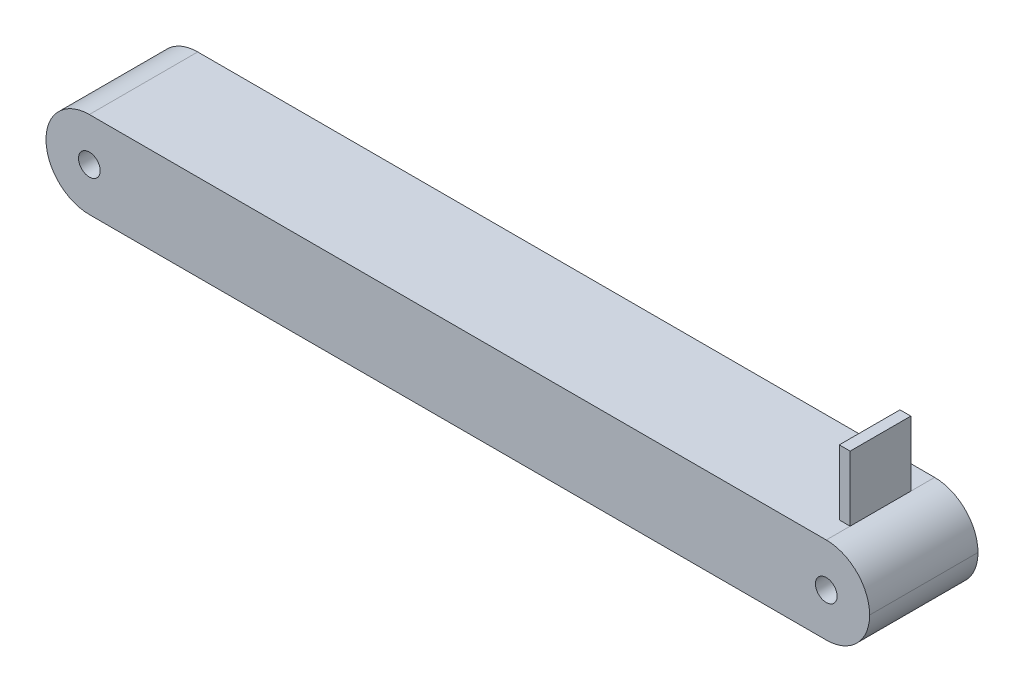
ISO-10303-21;
HEADER;
FILE_DESCRIPTION(('STEP AP214'),'2;1');
FILE_NAME('part.step','',(''),(''),'','','');
FILE_SCHEMA(('AUTOMOTIVE_DESIGN { 1 0 10303 214 1 1 1 1 }'));
ENDSEC;
DATA;
#1=APPLICATION_CONTEXT('core data for automotive mechanical design processes');
#2=APPLICATION_PROTOCOL_DEFINITION('international standard','automotive_design',2000,#1);
#3=PRODUCT_CONTEXT('',#1,'mechanical');
#4=PRODUCT('Part','Part','',(#3));
#5=PRODUCT_RELATED_PRODUCT_CATEGORY('part','',(#4));
#6=PRODUCT_DEFINITION_FORMATION('','',#4);
#7=PRODUCT_DEFINITION_CONTEXT('part definition',#1,'design');
#8=PRODUCT_DEFINITION('design','',#6,#7);
#9=PRODUCT_DEFINITION_SHAPE('','',#8);
#10=(LENGTH_UNIT() NAMED_UNIT(*) SI_UNIT(.MILLI.,.METRE.));
#11=(NAMED_UNIT(*) PLANE_ANGLE_UNIT() SI_UNIT($,.RADIAN.));
#12=(NAMED_UNIT(*) SI_UNIT($,.STERADIAN.) SOLID_ANGLE_UNIT());
#13=UNCERTAINTY_MEASURE_WITH_UNIT(LENGTH_MEASURE(1.E-05),#10,'distance_accuracy_value','');
#14=(GEOMETRIC_REPRESENTATION_CONTEXT(3) GLOBAL_UNCERTAINTY_ASSIGNED_CONTEXT((#13)) GLOBAL_UNIT_ASSIGNED_CONTEXT((#10,
#11,#12)) REPRESENTATION_CONTEXT('',''));
#15=CARTESIAN_POINT('',(0.,0.,0.));
#16=DIRECTION('',(0.,0.,1.));
#17=DIRECTION('',(1.,0.,0.));
#18=AXIS2_PLACEMENT_3D('',#15,#16,#17);
#19=CARTESIAN_POINT('',(0.,40.,0.));
#20=DIRECTION('',(0.,1.,0.));
#21=DIRECTION('',(0.,0.,1.));
#22=AXIS2_PLACEMENT_3D('',#19,#20,#21);
#23=PLANE('',#22);
#24=DIRECTION('',(0.,0.,1.));
#25=VECTOR('',#24,1.);
#26=CARTESIAN_POINT('',(198.626062322946,40.,19.5949008498583));
#27=LINE('',#26,#25);
#28=CARTESIAN_POINT('',(198.626062322946,40.,-8.40509915014166));
#29=VERTEX_POINT('',#28);
#30=CARTESIAN_POINT('',(198.626062322946,40.,19.5949008498583));
#31=VERTEX_POINT('',#30);
#32=EDGE_CURVE('E56',#29,#31,#27,.T.);
#33=ORIENTED_EDGE('',*,*,#32,.F.);
#34=DIRECTION('',(-1.,0.,0.));
#35=VECTOR('',#34,1.);
#36=CARTESIAN_POINT('',(203.626062322946,40.,-8.40509915014166));
#37=LINE('',#36,#35);
#38=CARTESIAN_POINT('',(203.626062322946,40.,-8.40509915014166));
#39=VERTEX_POINT('',#38);
#40=EDGE_CURVE('E352',#39,#29,#37,.T.);
#41=ORIENTED_EDGE('',*,*,#40,.F.);
#42=DIRECTION('',(0.,0.,-1.));
#43=VECTOR('',#42,1.);
#44=CARTESIAN_POINT('',(203.626062322946,40.,-19.4050991501417));
#45=LINE('',#44,#43);
#46=CARTESIAN_POINT('',(203.626062322946,40.,-19.4050991501417));
#47=VERTEX_POINT('',#46);
#48=EDGE_CURVE('E48',#39,#47,#45,.T.);
#49=ORIENTED_EDGE('',*,*,#48,.T.);
#50=DIRECTION('',(-1.,0.,0.));
#51=VECTOR('',#50,1.);
#52=CARTESIAN_POINT('',(-156.373937677054,40.,-19.4050991501417));
#53=LINE('',#52,#51);
#54=CARTESIAN_POINT('',(-136.373937677054,40.,-19.4050991501417));
#55=VERTEX_POINT('',#54);
#56=EDGE_CURVE('E241',#47,#55,#53,.T.);
#57=ORIENTED_EDGE('',*,*,#56,.T.);
#58=DIRECTION('',(0.,0.,1.));
#59=VECTOR('',#58,1.);
#60=CARTESIAN_POINT('',(-136.373937677054,40.,30.5949008498583));
#61=LINE('',#60,#59);
#62=CARTESIAN_POINT('',(-136.373937677054,40.,30.5949008498583));
#63=VERTEX_POINT('',#62);
#64=EDGE_CURVE('E271',#55,#63,#61,.T.);
#65=ORIENTED_EDGE('',*,*,#64,.T.);
#66=DIRECTION('',(1.,0.,0.));
#67=VECTOR('',#66,1.);
#68=CARTESIAN_POINT('',(-156.373937677054,40.,30.5949008498583));
#69=LINE('',#68,#67);
#70=CARTESIAN_POINT('',(203.626062322946,40.,30.5949008498583));
#71=VERTEX_POINT('',#70);
#72=EDGE_CURVE('E238',#63,#71,#69,.T.);
#73=ORIENTED_EDGE('',*,*,#72,.T.);
#74=CARTESIAN_POINT('',(203.626062322946,40.,19.5949008498583));
#75=VERTEX_POINT('',#74);
#76=EDGE_CURVE('E11',#71,#75,#45,.T.);
#77=ORIENTED_EDGE('',*,*,#76,.T.);
#78=DIRECTION('',(1.,0.,0.));
#79=VECTOR('',#78,1.);
#80=CARTESIAN_POINT('',(203.626062322946,40.,19.5949008498583));
#81=LINE('',#80,#79);
#82=EDGE_CURVE('E60',#31,#75,#81,.T.);
#83=ORIENTED_EDGE('',*,*,#82,.F.);
#84=EDGE_LOOP('',(#33,#41,#49,#57,#65,#73,#77,#83));
#85=FACE_BOUND('',#84,.T.);
#86=ADVANCED_FACE('F39',(#85),#23,.T.);
#87=CARTESIAN_POINT('',(-141.373937677054,35.,-19.4050991501417));
#88=DIRECTION('',(1.,0.,0.));
#89=DIRECTION('',(0.,0.,-1.));
#90=AXIS2_PLACEMENT_3D('',#87,#88,#89);
#91=PLANE('',#90);
#92=DIRECTION('',(0.,-1.,0.));
#93=VECTOR('',#92,1.);
#94=CARTESIAN_POINT('',(-141.373937677054,35.,15.5949008498583));
#95=LINE('',#94,#93);
#96=CARTESIAN_POINT('',(-141.373937677054,35.,15.5949008498583));
#97=VERTEX_POINT('',#96);
#98=CARTESIAN_POINT('',(-141.373937677054,20.,15.5949008498583));
#99=VERTEX_POINT('',#98);
#100=EDGE_CURVE('E234',#97,#99,#95,.T.);
#101=ORIENTED_EDGE('',*,*,#100,.T.);
#102=CARTESIAN_POINT('',(-141.373937677054,5.,15.5949008498583));
#103=VERTEX_POINT('',#102);
#104=EDGE_CURVE('E233',#99,#103,#95,.T.);
#105=ORIENTED_EDGE('',*,*,#104,.T.);
#106=DIRECTION('',(0.,0.,1.));
#107=VECTOR('',#106,1.);
#108=CARTESIAN_POINT('',(-141.373937677054,5.,-19.4050991501417));
#109=LINE('',#108,#107);
#110=CARTESIAN_POINT('',(-141.373937677054,5.,-4.40509915014166));
#111=VERTEX_POINT('',#110);
#112=EDGE_CURVE('E210',#111,#103,#109,.T.);
#113=ORIENTED_EDGE('',*,*,#112,.F.);
#114=DIRECTION('',(0.,-1.,0.));
#115=VECTOR('',#114,1.);
#116=CARTESIAN_POINT('',(-141.373937677054,35.,-4.40509915014166));
#117=LINE('',#116,#115);
#118=CARTESIAN_POINT('',(-141.373937677054,20.,-4.40509915014166));
#119=VERTEX_POINT('',#118);
#120=EDGE_CURVE('E209',#119,#111,#117,.T.);
#121=ORIENTED_EDGE('',*,*,#120,.F.);
#122=CARTESIAN_POINT('',(-141.373937677054,35.,-4.40509915014166));
#123=VERTEX_POINT('',#122);
#124=EDGE_CURVE('E222',#123,#119,#117,.T.);
#125=ORIENTED_EDGE('',*,*,#124,.F.);
#126=DIRECTION('',(0.,0.,1.));
#127=VECTOR('',#126,1.);
#128=CARTESIAN_POINT('',(-141.373937677054,35.,-19.4050991501417));
#129=LINE('',#128,#127);
#130=EDGE_CURVE('E199',#123,#97,#129,.T.);
#131=ORIENTED_EDGE('',*,*,#130,.T.);
#132=EDGE_LOOP('',(#101,#105,#113,#121,#125,#131));
#133=FACE_BOUND('',#132,.T.);
#134=ADVANCED_FACE('F299',(#133),#91,.T.);
#135=CARTESIAN_POINT('',(-156.373937677054,35.,15.5949008498583));
#136=DIRECTION('',(0.,0.,-1.));
#137=DIRECTION('',(-1.,0.,0.));
#138=AXIS2_PLACEMENT_3D('',#135,#136,#137);
#139=PLANE('',#138);
#140=ORIENTED_EDGE('',*,*,#104,.F.);
#141=CARTESIAN_POINT('',(-136.373937677054,20.,15.5949008498583));
#142=DIRECTION('',(0.,0.,-1.));
#143=DIRECTION('',(-1.,0.,0.));
#144=AXIS2_PLACEMENT_3D('',#141,#142,#143);
#145=CIRCLE('',#144,4.99999999999999);
#146=EDGE_CURVE('E196',#99,#99,#145,.T.);
#147=ORIENTED_EDGE('',*,*,#146,.F.);
#148=ORIENTED_EDGE('',*,*,#100,.F.);
#149=DIRECTION('',(1.,0.,0.));
#150=VECTOR('',#149,1.);
#151=CARTESIAN_POINT('',(-156.373937677054,35.,15.5949008498583));
#152=LINE('',#151,#150);
#153=CARTESIAN_POINT('',(208.626062322946,35.,15.5949008498583));
#154=VERTEX_POINT('',#153);
#155=EDGE_CURVE('E202',#97,#154,#152,.T.);
#156=ORIENTED_EDGE('',*,*,#155,.T.);
#157=DIRECTION('',(0.,-1.,0.));
#158=VECTOR('',#157,1.);
#159=CARTESIAN_POINT('',(208.626062322946,35.,15.5949008498583));
#160=LINE('',#159,#158);
#161=CARTESIAN_POINT('',(208.626062322946,20.,15.5949008498583));
#162=VERTEX_POINT('',#161);
#163=EDGE_CURVE('E230',#154,#162,#160,.T.);
#164=ORIENTED_EDGE('',*,*,#163,.T.);
#165=CARTESIAN_POINT('',(203.626062322946,20.,15.5949008498583));
#166=DIRECTION('',(0.,0.,-1.));
#167=DIRECTION('',(-1.,0.,0.));
#168=AXIS2_PLACEMENT_3D('',#165,#166,#167);
#169=CIRCLE('',#168,4.99999999999999);
#170=EDGE_CURVE('E194',#162,#162,#169,.T.);
#171=ORIENTED_EDGE('',*,*,#170,.F.);
#172=CARTESIAN_POINT('',(208.626062322946,5.,15.5949008498583));
#173=VERTEX_POINT('',#172);
#174=EDGE_CURVE('E229',#162,#173,#160,.T.);
#175=ORIENTED_EDGE('',*,*,#174,.T.);
#176=DIRECTION('',(1.,0.,0.));
#177=VECTOR('',#176,1.);
#178=CARTESIAN_POINT('',(-156.373937677054,5.,15.5949008498583));
#179=LINE('',#178,#177);
#180=EDGE_CURVE('E213',#103,#173,#179,.T.);
#181=ORIENTED_EDGE('',*,*,#180,.F.);
#182=EDGE_LOOP('',(#140,#147,#148,#156,#164,#171,#175,#181));
#183=FACE_BOUND('',#182,.T.);
#184=ADVANCED_FACE('F308',(#183),#139,.T.);
#185=CARTESIAN_POINT('',(208.626062322946,35.,-19.4050991501417));
#186=DIRECTION('',(-1.,0.,0.));
#187=DIRECTION('',(0.,0.,1.));
#188=AXIS2_PLACEMENT_3D('',#185,#186,#187);
#189=PLANE('',#188);
#190=ORIENTED_EDGE('',*,*,#174,.F.);
#191=ORIENTED_EDGE('',*,*,#163,.F.);
#192=DIRECTION('',(0.,0.,-1.));
#193=VECTOR('',#192,1.);
#194=CARTESIAN_POINT('',(208.626062322946,35.,-19.4050991501417));
#195=LINE('',#194,#193);
#196=CARTESIAN_POINT('',(208.626062322946,35.,-4.40509915014166));
#197=VERTEX_POINT('',#196);
#198=EDGE_CURVE('E205',#154,#197,#195,.T.);
#199=ORIENTED_EDGE('',*,*,#198,.T.);
#200=DIRECTION('',(0.,-1.,0.));
#201=VECTOR('',#200,1.);
#202=CARTESIAN_POINT('',(208.626062322946,35.,-4.40509915014166));
#203=LINE('',#202,#201);
#204=CARTESIAN_POINT('',(208.626062322946,20.,-4.40509915014166));
#205=VERTEX_POINT('',#204);
#206=EDGE_CURVE('E226',#197,#205,#203,.T.);
#207=ORIENTED_EDGE('',*,*,#206,.T.);
#208=CARTESIAN_POINT('',(208.626062322946,5.,-4.40509915014166));
#209=VERTEX_POINT('',#208);
#210=EDGE_CURVE('E225',#205,#209,#203,.T.);
#211=ORIENTED_EDGE('',*,*,#210,.T.);
#212=DIRECTION('',(0.,0.,-1.));
#213=VECTOR('',#212,1.);
#214=CARTESIAN_POINT('',(208.626062322946,5.,-19.4050991501417));
#215=LINE('',#214,#213);
#216=EDGE_CURVE('E217',#173,#209,#215,.T.);
#217=ORIENTED_EDGE('',*,*,#216,.F.);
#218=EDGE_LOOP('',(#190,#191,#199,#207,#211,#217));
#219=FACE_BOUND('',#218,.T.);
#220=ADVANCED_FACE('F289',(#219),#189,.T.);
#221=CARTESIAN_POINT('',(-156.373937677054,35.,-4.40509915014166));
#222=DIRECTION('',(0.,0.,1.));
#223=DIRECTION('',(1.,0.,0.));
#224=AXIS2_PLACEMENT_3D('',#221,#222,#223);
#225=PLANE('',#224);
#226=ORIENTED_EDGE('',*,*,#124,.T.);
#227=CARTESIAN_POINT('',(-136.373937677054,20.,-4.40509915014166));
#228=DIRECTION('',(0.,0.,1.));
#229=DIRECTION('',(1.,0.,0.));
#230=AXIS2_PLACEMENT_3D('',#227,#228,#229);
#231=CIRCLE('',#230,4.99999999999999);
#232=EDGE_CURVE('E43',#119,#119,#231,.T.);
#233=ORIENTED_EDGE('',*,*,#232,.F.);
#234=ORIENTED_EDGE('',*,*,#120,.T.);
#235=DIRECTION('',(-1.,0.,0.));
#236=VECTOR('',#235,1.);
#237=CARTESIAN_POINT('',(-156.373937677054,5.,-4.40509915014166));
#238=LINE('',#237,#236);
#239=EDGE_CURVE('E203',#209,#111,#238,.T.);
#240=ORIENTED_EDGE('',*,*,#239,.F.);
#241=ORIENTED_EDGE('',*,*,#210,.F.);
#242=CARTESIAN_POINT('',(203.626062322946,20.,-4.40509915014166));
#243=DIRECTION('',(0.,0.,1.));
#244=DIRECTION('',(1.,0.,0.));
#245=AXIS2_PLACEMENT_3D('',#242,#243,#244);
#246=CIRCLE('',#245,4.99999999999999);
#247=EDGE_CURVE('E188',#205,#205,#246,.T.);
#248=ORIENTED_EDGE('',*,*,#247,.F.);
#249=ORIENTED_EDGE('',*,*,#206,.F.);
#250=DIRECTION('',(-1.,0.,0.));
#251=VECTOR('',#250,1.);
#252=CARTESIAN_POINT('',(-156.373937677054,35.,-4.40509915014166));
#253=LINE('',#252,#251);
#254=EDGE_CURVE('E207',#197,#123,#253,.T.);
#255=ORIENTED_EDGE('',*,*,#254,.T.);
#256=EDGE_LOOP('',(#226,#233,#234,#240,#241,#248,#249,#255));
#257=FACE_BOUND('',#256,.T.);
#258=ADVANCED_FACE('F283',(#257),#225,.T.);
#259=CARTESIAN_POINT('',(0.,35.,0.));
#260=DIRECTION('',(0.,1.,0.));
#261=DIRECTION('',(0.,0.,1.));
#262=AXIS2_PLACEMENT_3D('',#259,#260,#261);
#263=PLANE('',#262);
#264=ORIENTED_EDGE('',*,*,#130,.F.);
#265=ORIENTED_EDGE('',*,*,#254,.F.);
#266=ORIENTED_EDGE('',*,*,#198,.F.);
#267=ORIENTED_EDGE('',*,*,#155,.F.);
#268=EDGE_LOOP('',(#264,#265,#266,#267));
#269=FACE_BOUND('',#268,.T.);
#270=ADVANCED_FACE('F294',(#269),#263,.F.);
#271=CARTESIAN_POINT('',(0.,5.,0.));
#272=DIRECTION('',(0.,1.,0.));
#273=DIRECTION('',(0.,0.,1.));
#274=AXIS2_PLACEMENT_3D('',#271,#272,#273);
#275=PLANE('',#274);
#276=ORIENTED_EDGE('',*,*,#112,.T.);
#277=ORIENTED_EDGE('',*,*,#180,.T.);
#278=ORIENTED_EDGE('',*,*,#216,.T.);
#279=ORIENTED_EDGE('',*,*,#239,.T.);
#280=EDGE_LOOP('',(#276,#277,#278,#279));
#281=FACE_BOUND('',#280,.T.);
#282=ADVANCED_FACE('F303',(#281),#275,.T.);
#283=CARTESIAN_POINT('',(203.626062322946,20.,-19.4050991501417));
#284=DIRECTION('',(0.,0.,1.));
#285=DIRECTION('',(1.,0.,0.));
#286=AXIS2_PLACEMENT_3D('',#283,#284,#285);
#287=CYLINDRICAL_SURFACE('',#286,4.99999999999999);
#288=ORIENTED_EDGE('',*,*,#247,.T.);
#289=EDGE_LOOP('',(#288));
#290=FACE_BOUND('',#289,.T.);
#291=CARTESIAN_POINT('',(203.626062322946,20.,-19.4050991501417));
#292=DIRECTION('',(0.,0.,1.));
#293=DIRECTION('',(1.,0.,0.));
#294=AXIS2_PLACEMENT_3D('',#291,#292,#293);
#295=CIRCLE('',#294,4.99999999999999);
#296=CARTESIAN_POINT('',(208.626062322946,20.,-19.4050991501417));
#297=VERTEX_POINT('',#296);
#298=EDGE_CURVE('E179',#297,#297,#295,.T.);
#299=ORIENTED_EDGE('',*,*,#298,.F.);
#300=EDGE_LOOP('',(#299));
#301=FACE_BOUND('',#300,.T.);
#302=ADVANCED_FACE('F278',(#290,#301),#287,.F.);
#303=CARTESIAN_POINT('',(-136.373937677054,20.,-19.4050991501417));
#304=DIRECTION('',(0.,0.,1.));
#305=DIRECTION('',(1.,0.,0.));
#306=AXIS2_PLACEMENT_3D('',#303,#304,#305);
#307=CYLINDRICAL_SURFACE('',#306,4.99999999999999);
#308=ORIENTED_EDGE('',*,*,#232,.T.);
#309=EDGE_LOOP('',(#308));
#310=FACE_BOUND('',#309,.T.);
#311=CARTESIAN_POINT('',(-136.373937677054,20.,-19.4050991501417));
#312=DIRECTION('',(0.,0.,1.));
#313=DIRECTION('',(1.,0.,0.));
#314=AXIS2_PLACEMENT_3D('',#311,#312,#313);
#315=CIRCLE('',#314,4.99999999999999);
#316=CARTESIAN_POINT('',(-131.373937677054,20.,-19.4050991501417));
#317=VERTEX_POINT('',#316);
#318=EDGE_CURVE('E185',#317,#317,#315,.T.);
#319=ORIENTED_EDGE('',*,*,#318,.F.);
#320=EDGE_LOOP('',(#319));
#321=FACE_BOUND('',#320,.T.);
#322=ADVANCED_FACE('F317',(#310,#321),#307,.F.);
#323=ORIENTED_EDGE('',*,*,#170,.T.);
#324=EDGE_LOOP('',(#323));
#325=FACE_BOUND('',#324,.T.);
#326=CARTESIAN_POINT('',(203.626062322946,20.,30.5949008498583));
#327=DIRECTION('',(0.,0.,1.));
#328=DIRECTION('',(1.,0.,0.));
#329=AXIS2_PLACEMENT_3D('',#326,#327,#328);
#330=CIRCLE('',#329,4.99999999999999);
#331=CARTESIAN_POINT('',(208.626062322946,20.,30.5949008498583));
#332=VERTEX_POINT('',#331);
#333=EDGE_CURVE('E176',#332,#332,#330,.T.);
#334=ORIENTED_EDGE('',*,*,#333,.T.);
#335=EDGE_LOOP('',(#334));
#336=FACE_BOUND('',#335,.T.);
#337=ADVANCED_FACE('F315',(#325,#336),#287,.F.);
#338=ORIENTED_EDGE('',*,*,#146,.T.);
#339=EDGE_LOOP('',(#338));
#340=FACE_BOUND('',#339,.T.);
#341=CARTESIAN_POINT('',(-136.373937677054,20.,30.5949008498583));
#342=DIRECTION('',(0.,0.,1.));
#343=DIRECTION('',(1.,0.,0.));
#344=AXIS2_PLACEMENT_3D('',#341,#342,#343);
#345=CIRCLE('',#344,4.99999999999999);
#346=CARTESIAN_POINT('',(-131.373937677054,20.,30.5949008498583));
#347=VERTEX_POINT('',#346);
#348=EDGE_CURVE('E189',#347,#347,#345,.T.);
#349=ORIENTED_EDGE('',*,*,#348,.T.);
#350=EDGE_LOOP('',(#349));
#351=FACE_BOUND('',#350,.T.);
#352=ADVANCED_FACE('F311',(#340,#351),#307,.F.);
#353=CARTESIAN_POINT('',(-156.373937677054,40.,30.5949008498583));
#354=DIRECTION('',(0.,0.,-1.));
#355=DIRECTION('',(-1.,0.,0.));
#356=AXIS2_PLACEMENT_3D('',#353,#354,#355);
#357=PLANE('',#356);
#358=ORIENTED_EDGE('',*,*,#348,.F.);
#359=EDGE_LOOP('',(#358));
#360=FACE_BOUND('',#359,.T.);
#361=ORIENTED_EDGE('',*,*,#333,.F.);
#362=EDGE_LOOP('',(#361));
#363=FACE_BOUND('',#362,.T.);
#364=DIRECTION('',(1.,0.,0.));
#365=VECTOR('',#364,1.);
#366=CARTESIAN_POINT('',(-156.373937677054,0.,30.5949008498583));
#367=LINE('',#366,#365);
#368=CARTESIAN_POINT('',(-136.373937677054,0.,30.5949008498583));
#369=VERTEX_POINT('',#368);
#370=CARTESIAN_POINT('',(203.626062322946,0.,30.5949008498583));
#371=VERTEX_POINT('',#370);
#372=EDGE_CURVE('E237',#369,#371,#367,.T.);
#373=ORIENTED_EDGE('',*,*,#372,.T.);
#374=CARTESIAN_POINT('',(203.626062322946,20.,30.5949008498583));
#375=DIRECTION('',(0.,0.,-1.));
#376=DIRECTION('',(-1.,0.,0.));
#377=AXIS2_PLACEMENT_3D('',#374,#375,#376);
#378=CIRCLE('',#377,20.);
#379=CARTESIAN_POINT('',(223.626062322946,20.,30.5949008498583));
#380=VERTEX_POINT('',#379);
#381=EDGE_CURVE('E269',#371,#380,#378,.F.);
#382=ORIENTED_EDGE('',*,*,#381,.T.);
#383=CARTESIAN_POINT('',(203.626062322946,20.,30.5949008498583));
#384=DIRECTION('',(0.,0.,-1.));
#385=DIRECTION('',(-1.,0.,0.));
#386=AXIS2_PLACEMENT_3D('',#383,#384,#385);
#387=CIRCLE('',#386,20.);
#388=EDGE_CURVE('E267',#380,#71,#387,.F.);
#389=ORIENTED_EDGE('',*,*,#388,.T.);
#390=ORIENTED_EDGE('',*,*,#72,.F.);
#391=CARTESIAN_POINT('',(-136.373937677054,20.,30.5949008498583));
#392=DIRECTION('',(0.,0.,-1.));
#393=DIRECTION('',(-1.,0.,0.));
#394=AXIS2_PLACEMENT_3D('',#391,#392,#393);
#395=CIRCLE('',#394,20.);
#396=CARTESIAN_POINT('',(-156.373937677054,20.,30.5949008498583));
#397=VERTEX_POINT('',#396);
#398=EDGE_CURVE('E263',#63,#397,#395,.F.);
#399=ORIENTED_EDGE('',*,*,#398,.T.);
#400=CARTESIAN_POINT('',(-136.373937677054,20.,30.5949008498583));
#401=DIRECTION('',(0.,0.,-1.));
#402=DIRECTION('',(-1.,0.,0.));
#403=AXIS2_PLACEMENT_3D('',#400,#401,#402);
#404=CIRCLE('',#403,20.);
#405=EDGE_CURVE('E265',#397,#369,#404,.F.);
#406=ORIENTED_EDGE('',*,*,#405,.T.);
#407=EDGE_LOOP('',(#373,#382,#389,#390,#399,#406));
#408=FACE_BOUND('',#407,.T.);
#409=ADVANCED_FACE('F314',(#360,#363,#408),#357,.F.);
#410=CARTESIAN_POINT('',(-156.373937677054,40.,-19.4050991501417));
#411=DIRECTION('',(0.,0.,1.));
#412=DIRECTION('',(1.,0.,0.));
#413=AXIS2_PLACEMENT_3D('',#410,#411,#412);
#414=PLANE('',#413);
#415=ORIENTED_EDGE('',*,*,#318,.T.);
#416=EDGE_LOOP('',(#415));
#417=FACE_BOUND('',#416,.T.);
#418=ORIENTED_EDGE('',*,*,#298,.T.);
#419=EDGE_LOOP('',(#418));
#420=FACE_BOUND('',#419,.T.);
#421=CARTESIAN_POINT('',(203.626062322946,20.,-19.4050991501417));
#422=DIRECTION('',(0.,0.,1.));
#423=DIRECTION('',(1.,0.,0.));
#424=AXIS2_PLACEMENT_3D('',#421,#422,#423);
#425=CIRCLE('',#424,20.);
#426=CARTESIAN_POINT('',(223.626062322946,20.,-19.4050991501417));
#427=VERTEX_POINT('',#426);
#428=EDGE_CURVE('E253',#47,#427,#425,.F.);
#429=ORIENTED_EDGE('',*,*,#428,.T.);
#430=CARTESIAN_POINT('',(203.626062322946,20.,-19.4050991501417));
#431=DIRECTION('',(0.,0.,1.));
#432=DIRECTION('',(1.,0.,0.));
#433=AXIS2_PLACEMENT_3D('',#430,#431,#432);
#434=CIRCLE('',#433,20.);
#435=CARTESIAN_POINT('',(203.626062322946,0.,-19.4050991501417));
#436=VERTEX_POINT('',#435);
#437=EDGE_CURVE('E255',#427,#436,#434,.F.);
#438=ORIENTED_EDGE('',*,*,#437,.T.);
#439=DIRECTION('',(-1.,0.,0.));
#440=VECTOR('',#439,1.);
#441=CARTESIAN_POINT('',(-156.373937677054,0.,-19.4050991501417));
#442=LINE('',#441,#440);
#443=CARTESIAN_POINT('',(-136.373937677054,0.,-19.4050991501417));
#444=VERTEX_POINT('',#443);
#445=EDGE_CURVE('E242',#436,#444,#442,.T.);
#446=ORIENTED_EDGE('',*,*,#445,.T.);
#447=CARTESIAN_POINT('',(-136.373937677054,20.,-19.4050991501417));
#448=DIRECTION('',(0.,0.,1.));
#449=DIRECTION('',(1.,0.,0.));
#450=AXIS2_PLACEMENT_3D('',#447,#448,#449);
#451=CIRCLE('',#450,20.);
#452=CARTESIAN_POINT('',(-156.373937677054,20.,-19.4050991501417));
#453=VERTEX_POINT('',#452);
#454=EDGE_CURVE('E251',#444,#453,#451,.F.);
#455=ORIENTED_EDGE('',*,*,#454,.T.);
#456=CARTESIAN_POINT('',(-136.373937677054,20.,-19.4050991501417));
#457=DIRECTION('',(0.,0.,1.));
#458=DIRECTION('',(1.,0.,0.));
#459=AXIS2_PLACEMENT_3D('',#456,#457,#458);
#460=CIRCLE('',#459,20.);
#461=EDGE_CURVE('E245',#453,#55,#460,.F.);
#462=ORIENTED_EDGE('',*,*,#461,.T.);
#463=ORIENTED_EDGE('',*,*,#56,.F.);
#464=EDGE_LOOP('',(#429,#438,#446,#455,#462,#463));
#465=FACE_BOUND('',#464,.T.);
#466=ADVANCED_FACE('F322',(#417,#420,#465),#414,.F.);
#467=CARTESIAN_POINT('',(0.,0.,0.));
#468=DIRECTION('',(0.,1.,0.));
#469=DIRECTION('',(0.,0.,1.));
#470=AXIS2_PLACEMENT_3D('',#467,#468,#469);
#471=PLANE('',#470);
#472=ORIENTED_EDGE('',*,*,#445,.F.);
#473=DIRECTION('',(0.,0.,-1.));
#474=VECTOR('',#473,1.);
#475=CARTESIAN_POINT('',(203.626062322946,0.,0.));
#476=LINE('',#475,#474);
#477=EDGE_CURVE('E260',#436,#371,#476,.F.);
#478=ORIENTED_EDGE('',*,*,#477,.T.);
#479=ORIENTED_EDGE('',*,*,#372,.F.);
#480=DIRECTION('',(0.,0.,1.));
#481=VECTOR('',#480,1.);
#482=CARTESIAN_POINT('',(-136.373937677054,0.,0.));
#483=LINE('',#482,#481);
#484=EDGE_CURVE('E257',#369,#444,#483,.F.);
#485=ORIENTED_EDGE('',*,*,#484,.T.);
#486=EDGE_LOOP('',(#472,#478,#479,#485));
#487=FACE_BOUND('',#486,.T.);
#488=ADVANCED_FACE('F332',(#487),#471,.F.);
#489=CARTESIAN_POINT('',(203.626062322946,20.,0.));
#490=DIRECTION('',(0.,0.,1.));
#491=DIRECTION('',(1.,0.,0.));
#492=AXIS2_PLACEMENT_3D('',#489,#490,#491);
#493=CYLINDRICAL_SURFACE('',#492,20.);
#494=ORIENTED_EDGE('',*,*,#76,.F.);
#495=ORIENTED_EDGE('',*,*,#388,.F.);
#496=DIRECTION('',(0.,0.,-1.));
#497=VECTOR('',#496,1.);
#498=CARTESIAN_POINT('',(223.626062322946,20.,30.5949008498583));
#499=LINE('',#498,#497);
#500=EDGE_CURVE('E214',#427,#380,#499,.F.);
#501=ORIENTED_EDGE('',*,*,#500,.F.);
#502=ORIENTED_EDGE('',*,*,#428,.F.);
#503=ORIENTED_EDGE('',*,*,#48,.F.);
#504=DIRECTION('',(0.,0.,-1.));
#505=VECTOR('',#504,1.);
#506=CARTESIAN_POINT('',(203.626062322946,40.,19.5949008498583));
#507=LINE('',#506,#505);
#508=EDGE_CURVE('E175',#75,#39,#507,.T.);
#509=ORIENTED_EDGE('',*,*,#508,.F.);
#510=EDGE_LOOP('',(#494,#495,#501,#502,#503,#509));
#511=FACE_BOUND('',#510,.T.);
#512=ADVANCED_FACE('F347',(#511),#493,.T.);
#513=CARTESIAN_POINT('',(203.626062322946,20.,-19.4050991501417));
#514=DIRECTION('',(0.,0.,-1.));
#515=DIRECTION('',(-1.,0.,0.));
#516=AXIS2_PLACEMENT_3D('',#513,#514,#515);
#517=CYLINDRICAL_SURFACE('',#516,20.);
#518=ORIENTED_EDGE('',*,*,#381,.F.);
#519=ORIENTED_EDGE('',*,*,#477,.F.);
#520=ORIENTED_EDGE('',*,*,#437,.F.);
#521=ORIENTED_EDGE('',*,*,#500,.T.);
#522=EDGE_LOOP('',(#518,#519,#520,#521));
#523=FACE_BOUND('',#522,.T.);
#524=ADVANCED_FACE('F351',(#523),#517,.T.);
#525=CARTESIAN_POINT('',(-136.373937677054,20.,0.));
#526=DIRECTION('',(0.,0.,-1.));
#527=DIRECTION('',(-1.,0.,0.));
#528=AXIS2_PLACEMENT_3D('',#525,#526,#527);
#529=CYLINDRICAL_SURFACE('',#528,20.);
#530=ORIENTED_EDGE('',*,*,#64,.F.);
#531=ORIENTED_EDGE('',*,*,#461,.F.);
#532=DIRECTION('',(0.,0.,1.));
#533=VECTOR('',#532,1.);
#534=CARTESIAN_POINT('',(-156.373937677054,20.,-19.4050991501417));
#535=LINE('',#534,#533);
#536=EDGE_CURVE('E198',#397,#453,#535,.F.);
#537=ORIENTED_EDGE('',*,*,#536,.F.);
#538=ORIENTED_EDGE('',*,*,#398,.F.);
#539=EDGE_LOOP('',(#530,#531,#537,#538));
#540=FACE_BOUND('',#539,.T.);
#541=ADVANCED_FACE('F41',(#540),#529,.T.);
#542=CARTESIAN_POINT('',(-136.373937677054,20.,-19.4050991501417));
#543=DIRECTION('',(0.,0.,1.));
#544=DIRECTION('',(1.,0.,0.));
#545=AXIS2_PLACEMENT_3D('',#542,#543,#544);
#546=CYLINDRICAL_SURFACE('',#545,20.);
#547=ORIENTED_EDGE('',*,*,#454,.F.);
#548=ORIENTED_EDGE('',*,*,#484,.F.);
#549=ORIENTED_EDGE('',*,*,#405,.F.);
#550=ORIENTED_EDGE('',*,*,#536,.T.);
#551=EDGE_LOOP('',(#547,#548,#549,#550));
#552=FACE_BOUND('',#551,.T.);
#553=ADVANCED_FACE('F335',(#552),#546,.T.);
#554=CARTESIAN_POINT('',(203.626062322946,70.,19.5949008498583));
#555=DIRECTION('',(-1.,0.,0.));
#556=DIRECTION('',(0.,0.,1.));
#557=AXIS2_PLACEMENT_3D('',#554,#555,#556);
#558=PLANE('',#557);
#559=ORIENTED_EDGE('',*,*,#508,.T.);
#560=DIRECTION('',(0.,-1.,0.));
#561=VECTOR('',#560,1.);
#562=CARTESIAN_POINT('',(203.626062322946,70.,-8.40509915014166));
#563=LINE('',#562,#561);
#564=CARTESIAN_POINT('',(203.626062322946,70.,-8.40509915014166));
#565=VERTEX_POINT('',#564);
#566=EDGE_CURVE('E157',#565,#39,#563,.T.);
#567=ORIENTED_EDGE('',*,*,#566,.F.);
#568=DIRECTION('',(0.,0.,-1.));
#569=VECTOR('',#568,1.);
#570=CARTESIAN_POINT('',(203.626062322946,70.,19.5949008498583));
#571=LINE('',#570,#569);
#572=CARTESIAN_POINT('',(203.626062322946,70.,19.5949008498583));
#573=VERTEX_POINT('',#572);
#574=EDGE_CURVE('E164',#573,#565,#571,.T.);
#575=ORIENTED_EDGE('',*,*,#574,.F.);
#576=DIRECTION('',(0.,-1.,0.));
#577=VECTOR('',#576,1.);
#578=CARTESIAN_POINT('',(203.626062322946,70.,19.5949008498583));
#579=LINE('',#578,#577);
#580=EDGE_CURVE('E359',#573,#75,#579,.T.);
#581=ORIENTED_EDGE('',*,*,#580,.T.);
#582=EDGE_LOOP('',(#559,#567,#575,#581));
#583=FACE_BOUND('',#582,.T.);
#584=ADVANCED_FACE('F174',(#583),#558,.F.);
#585=CARTESIAN_POINT('',(203.626062322946,70.,-8.40509915014166));
#586=DIRECTION('',(0.,0.,1.));
#587=DIRECTION('',(1.,0.,0.));
#588=AXIS2_PLACEMENT_3D('',#585,#586,#587);
#589=PLANE('',#588);
#590=ORIENTED_EDGE('',*,*,#40,.T.);
#591=DIRECTION('',(0.,-1.,0.));
#592=VECTOR('',#591,1.);
#593=CARTESIAN_POINT('',(198.626062322946,70.,-8.40509915014166));
#594=LINE('',#593,#592);
#595=CARTESIAN_POINT('',(198.626062322946,70.,-8.40509915014166));
#596=VERTEX_POINT('',#595);
#597=EDGE_CURVE('E160',#596,#29,#594,.T.);
#598=ORIENTED_EDGE('',*,*,#597,.F.);
#599=DIRECTION('',(-1.,0.,0.));
#600=VECTOR('',#599,1.);
#601=CARTESIAN_POINT('',(203.626062322946,70.,-8.40509915014166));
#602=LINE('',#601,#600);
#603=EDGE_CURVE('E153',#565,#596,#602,.T.);
#604=ORIENTED_EDGE('',*,*,#603,.F.);
#605=ORIENTED_EDGE('',*,*,#566,.T.);
#606=EDGE_LOOP('',(#590,#598,#604,#605));
#607=FACE_BOUND('',#606,.T.);
#608=ADVANCED_FACE('F155',(#607),#589,.F.);
#609=CARTESIAN_POINT('',(198.626062322946,70.,19.5949008498583));
#610=DIRECTION('',(1.,0.,0.));
#611=DIRECTION('',(0.,0.,-1.));
#612=AXIS2_PLACEMENT_3D('',#609,#610,#611);
#613=PLANE('',#612);
#614=ORIENTED_EDGE('',*,*,#32,.T.);
#615=DIRECTION('',(0.,-1.,0.));
#616=VECTOR('',#615,1.);
#617=CARTESIAN_POINT('',(198.626062322946,70.,19.5949008498583));
#618=LINE('',#617,#616);
#619=CARTESIAN_POINT('',(198.626062322946,70.,19.5949008498583));
#620=VERTEX_POINT('',#619);
#621=EDGE_CURVE('E181',#620,#31,#618,.T.);
#622=ORIENTED_EDGE('',*,*,#621,.F.);
#623=DIRECTION('',(0.,0.,1.));
#624=VECTOR('',#623,1.);
#625=CARTESIAN_POINT('',(198.626062322946,70.,19.5949008498583));
#626=LINE('',#625,#624);
#627=EDGE_CURVE('E163',#596,#620,#626,.T.);
#628=ORIENTED_EDGE('',*,*,#627,.F.);
#629=ORIENTED_EDGE('',*,*,#597,.T.);
#630=EDGE_LOOP('',(#614,#622,#628,#629));
#631=FACE_BOUND('',#630,.T.);
#632=ADVANCED_FACE('F365',(#631),#613,.F.);
#633=CARTESIAN_POINT('',(203.626062322946,70.,19.5949008498583));
#634=DIRECTION('',(0.,0.,-1.));
#635=DIRECTION('',(-1.,0.,0.));
#636=AXIS2_PLACEMENT_3D('',#633,#634,#635);
#637=PLANE('',#636);
#638=ORIENTED_EDGE('',*,*,#82,.T.);
#639=ORIENTED_EDGE('',*,*,#580,.F.);
#640=DIRECTION('',(1.,0.,0.));
#641=VECTOR('',#640,1.);
#642=CARTESIAN_POINT('',(203.626062322946,70.,19.5949008498583));
#643=LINE('',#642,#641);
#644=EDGE_CURVE('E169',#620,#573,#643,.T.);
#645=ORIENTED_EDGE('',*,*,#644,.F.);
#646=ORIENTED_EDGE('',*,*,#621,.T.);
#647=EDGE_LOOP('',(#638,#639,#645,#646));
#648=FACE_BOUND('',#647,.T.);
#649=ADVANCED_FACE('F363',(#648),#637,.F.);
#650=CARTESIAN_POINT('',(0.,70.,0.));
#651=DIRECTION('',(0.,1.,0.));
#652=DIRECTION('',(0.,0.,1.));
#653=AXIS2_PLACEMENT_3D('',#650,#651,#652);
#654=PLANE('',#653);
#655=ORIENTED_EDGE('',*,*,#574,.T.);
#656=ORIENTED_EDGE('',*,*,#603,.T.);
#657=ORIENTED_EDGE('',*,*,#627,.T.);
#658=ORIENTED_EDGE('',*,*,#644,.T.);
#659=EDGE_LOOP('',(#655,#656,#657,#658));
#660=FACE_BOUND('',#659,.T.);
#661=ADVANCED_FACE('F167',(#660),#654,.T.);
#662=CLOSED_SHELL('',(#86,#134,#184,#220,#258,#270,#282,#302,#322,#337,#352,#409,#466,#488,#512,
#524,#541,#553,#584,#608,#632,#649,#661));
#663=MANIFOLD_SOLID_BREP('B2',#662);
#664=ADVANCED_BREP_SHAPE_REPRESENTATION('',(#18,#663),#14);
#665=SHAPE_DEFINITION_REPRESENTATION(#9,#664);
ENDSEC;
END-ISO-10303-21;
